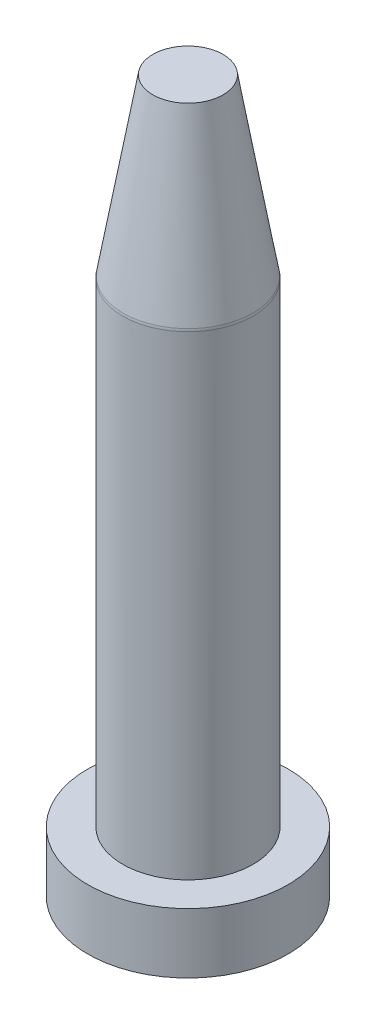
ISO-10303-21;
HEADER;
FILE_DESCRIPTION(('STEP AP214'),'2;1');
FILE_NAME('part.step','',(''),(''),'','','');
FILE_SCHEMA(('AUTOMOTIVE_DESIGN { 1 0 10303 214 1 1 1 1 }'));
ENDSEC;
DATA;
#1=APPLICATION_CONTEXT('core data for automotive mechanical design processes');
#2=APPLICATION_PROTOCOL_DEFINITION('international standard','automotive_design',2000,#1);
#3=PRODUCT_CONTEXT('',#1,'mechanical');
#4=PRODUCT('Part','Part','',(#3));
#5=PRODUCT_RELATED_PRODUCT_CATEGORY('part','',(#4));
#6=PRODUCT_DEFINITION_FORMATION('','',#4);
#7=PRODUCT_DEFINITION_CONTEXT('part definition',#1,'design');
#8=PRODUCT_DEFINITION('design','',#6,#7);
#9=PRODUCT_DEFINITION_SHAPE('','',#8);
#10=(LENGTH_UNIT() NAMED_UNIT(*) SI_UNIT(.MILLI.,.METRE.));
#11=(NAMED_UNIT(*) PLANE_ANGLE_UNIT() SI_UNIT($,.RADIAN.));
#12=(NAMED_UNIT(*) SI_UNIT($,.STERADIAN.) SOLID_ANGLE_UNIT());
#13=UNCERTAINTY_MEASURE_WITH_UNIT(LENGTH_MEASURE(1.E-05),#10,'distance_accuracy_value','');
#14=(GEOMETRIC_REPRESENTATION_CONTEXT(3) GLOBAL_UNCERTAINTY_ASSIGNED_CONTEXT((#13)) GLOBAL_UNIT_ASSIGNED_CONTEXT((#10,
#11,#12)) REPRESENTATION_CONTEXT('',''));
#15=CARTESIAN_POINT('',(0.,0.,0.));
#16=DIRECTION('',(0.,0.,1.));
#17=DIRECTION('',(1.,0.,0.));
#18=AXIS2_PLACEMENT_3D('',#15,#16,#17);
#19=CARTESIAN_POINT('',(0.,142.,0.));
#20=DIRECTION('',(0.,1.,0.));
#21=DIRECTION('',(0.,0.,1.));
#22=AXIS2_PLACEMENT_3D('',#19,#20,#21);
#23=PLANE('',#22);
#24=CARTESIAN_POINT('',(0.,142.,0.));
#25=DIRECTION('',(0.,-1.,0.));
#26=DIRECTION('',(0.,0.,-1.));
#27=AXIS2_PLACEMENT_3D('',#24,#25,#26);
#28=CIRCLE('',#27,7.);
#29=CARTESIAN_POINT('',(0.,142.,-7.));
#30=VERTEX_POINT('',#29);
#31=EDGE_CURVE('E43',#30,#30,#28,.T.);
#32=ORIENTED_EDGE('',*,*,#31,.F.);
#33=EDGE_LOOP('',(#32));
#34=FACE_BOUND('',#33,.T.);
#35=ADVANCED_FACE('F32',(#34),#23,.T.);
#36=CARTESIAN_POINT('',(0.,107.,0.));
#37=DIRECTION('',(0.,-1.,0.));
#38=DIRECTION('',(0.,0.,-1.));
#39=AXIS2_PLACEMENT_3D('',#36,#37,#38);
#40=CONICAL_SURFACE('',#39,13.,0.169778273968338);
#41=CARTESIAN_POINT('',(0.,107.251610540768,0.));
#42=DIRECTION('',(0.,1.,0.));
#43=DIRECTION('',(0.,0.,1.));
#44=AXIS2_PLACEMENT_3D('',#41,#42,#43);
#45=CIRCLE('',#44,12.9568667644398);
#46=CARTESIAN_POINT('',(0.,107.251610540768,12.9568667644398));
#47=VERTEX_POINT('',#46);
#48=EDGE_CURVE('E10',#47,#47,#45,.T.);
#49=ORIENTED_EDGE('',*,*,#48,.T.);
#50=EDGE_LOOP('',(#49));
#51=FACE_BOUND('',#50,.T.);
#52=ORIENTED_EDGE('',*,*,#31,.T.);
#53=EDGE_LOOP('',(#52));
#54=FACE_BOUND('',#53,.T.);
#55=ADVANCED_FACE('F75',(#51,#54),#40,.T.);
#56=CARTESIAN_POINT('',(0.,0.,0.));
#57=DIRECTION('',(0.,-1.,0.));
#58=DIRECTION('',(0.,0.,-1.));
#59=AXIS2_PLACEMENT_3D('',#56,#57,#58);
#60=CYLINDRICAL_SURFACE('',#59,13.);
#61=CARTESIAN_POINT('',(0.,106.744719095435,0.));
#62=DIRECTION('',(0.,1.,0.));
#63=DIRECTION('',(0.,0.,1.));
#64=AXIS2_PLACEMENT_3D('',#61,#62,#63);
#65=CIRCLE('',#64,13.);
#66=CARTESIAN_POINT('',(0.,106.744719095435,13.));
#67=VERTEX_POINT('',#66);
#68=EDGE_CURVE('E39',#67,#67,#65,.F.);
#69=ORIENTED_EDGE('',*,*,#68,.T.);
#70=EDGE_LOOP('',(#69));
#71=FACE_BOUND('',#70,.T.);
#72=CARTESIAN_POINT('',(0.,12.,0.));
#73=DIRECTION('',(0.,-1.,0.));
#74=DIRECTION('',(0.,0.,-1.));
#75=AXIS2_PLACEMENT_3D('',#72,#73,#74);
#76=CIRCLE('',#75,13.);
#77=CARTESIAN_POINT('',(0.,12.,-13.));
#78=VERTEX_POINT('',#77);
#79=EDGE_CURVE('E47',#78,#78,#76,.T.);
#80=ORIENTED_EDGE('',*,*,#79,.F.);
#81=EDGE_LOOP('',(#80));
#82=FACE_BOUND('',#81,.T.);
#83=ADVANCED_FACE('F71',(#71,#82),#60,.T.);
#84=CARTESIAN_POINT('',(20.,12.,0.));
#85=DIRECTION('',(0.,1.,0.));
#86=DIRECTION('',(0.,0.,1.));
#87=AXIS2_PLACEMENT_3D('',#84,#85,#86);
#88=PLANE('',#87);
#89=ORIENTED_EDGE('',*,*,#79,.T.);
#90=EDGE_LOOP('',(#89));
#91=FACE_BOUND('',#90,.T.);
#92=CARTESIAN_POINT('',(0.,12.,0.));
#93=DIRECTION('',(0.,-1.,0.));
#94=DIRECTION('',(0.,0.,-1.));
#95=AXIS2_PLACEMENT_3D('',#92,#93,#94);
#96=CIRCLE('',#95,20.);
#97=CARTESIAN_POINT('',(0.,12.,-20.));
#98=VERTEX_POINT('',#97);
#99=EDGE_CURVE('E52',#98,#98,#96,.T.);
#100=ORIENTED_EDGE('',*,*,#99,.F.);
#101=EDGE_LOOP('',(#100));
#102=FACE_BOUND('',#101,.T.);
#103=ADVANCED_FACE('F63',(#91,#102),#88,.T.);
#104=CARTESIAN_POINT('',(0.,0.,0.));
#105=DIRECTION('',(0.,-1.,0.));
#106=DIRECTION('',(0.,0.,-1.));
#107=AXIS2_PLACEMENT_3D('',#104,#105,#106);
#108=CYLINDRICAL_SURFACE('',#107,20.);
#109=ORIENTED_EDGE('',*,*,#99,.T.);
#110=EDGE_LOOP('',(#109));
#111=FACE_BOUND('',#110,.T.);
#112=CARTESIAN_POINT('',(0.,0.,0.));
#113=DIRECTION('',(0.,-1.,0.));
#114=DIRECTION('',(0.,0.,-1.));
#115=AXIS2_PLACEMENT_3D('',#112,#113,#114);
#116=CIRCLE('',#115,20.);
#117=CARTESIAN_POINT('',(0.,0.,-20.));
#118=VERTEX_POINT('',#117);
#119=EDGE_CURVE('E55',#118,#118,#116,.T.);
#120=ORIENTED_EDGE('',*,*,#119,.F.);
#121=EDGE_LOOP('',(#120));
#122=FACE_BOUND('',#121,.T.);
#123=ADVANCED_FACE('F61',(#111,#122),#108,.T.);
#124=CARTESIAN_POINT('',(0.,0.,0.));
#125=DIRECTION('',(0.,-1.,0.));
#126=DIRECTION('',(0.,0.,-1.));
#127=AXIS2_PLACEMENT_3D('',#124,#125,#126);
#128=PLANE('',#127);
#129=ORIENTED_EDGE('',*,*,#119,.T.);
#130=EDGE_LOOP('',(#129));
#131=FACE_BOUND('',#130,.T.);
#132=ADVANCED_FACE('F59',(#131),#128,.T.);
#133=CARTESIAN_POINT('',(0.,106.744719095435,0.));
#134=DIRECTION('',(0.,1.,0.));
#135=DIRECTION('',(0.,0.,1.));
#136=AXIS2_PLACEMENT_3D('',#133,#134,#135);
#137=TOROIDAL_SURFACE('',#136,10.,3.);
#138=ORIENTED_EDGE('',*,*,#48,.F.);
#139=EDGE_LOOP('',(#138));
#140=FACE_BOUND('',#139,.T.);
#141=ORIENTED_EDGE('',*,*,#68,.F.);
#142=EDGE_LOOP('',(#141));
#143=FACE_BOUND('',#142,.T.);
#144=ADVANCED_FACE('F34',(#140,#143),#137,.T.);
#145=CLOSED_SHELL('',(#35,#55,#83,#103,#123,#132,#144));
#146=MANIFOLD_SOLID_BREP('B2',#145);
#147=ADVANCED_BREP_SHAPE_REPRESENTATION('',(#18,#146),#14);
#148=SHAPE_DEFINITION_REPRESENTATION(#9,#147);
ENDSEC;
END-ISO-10303-21;
